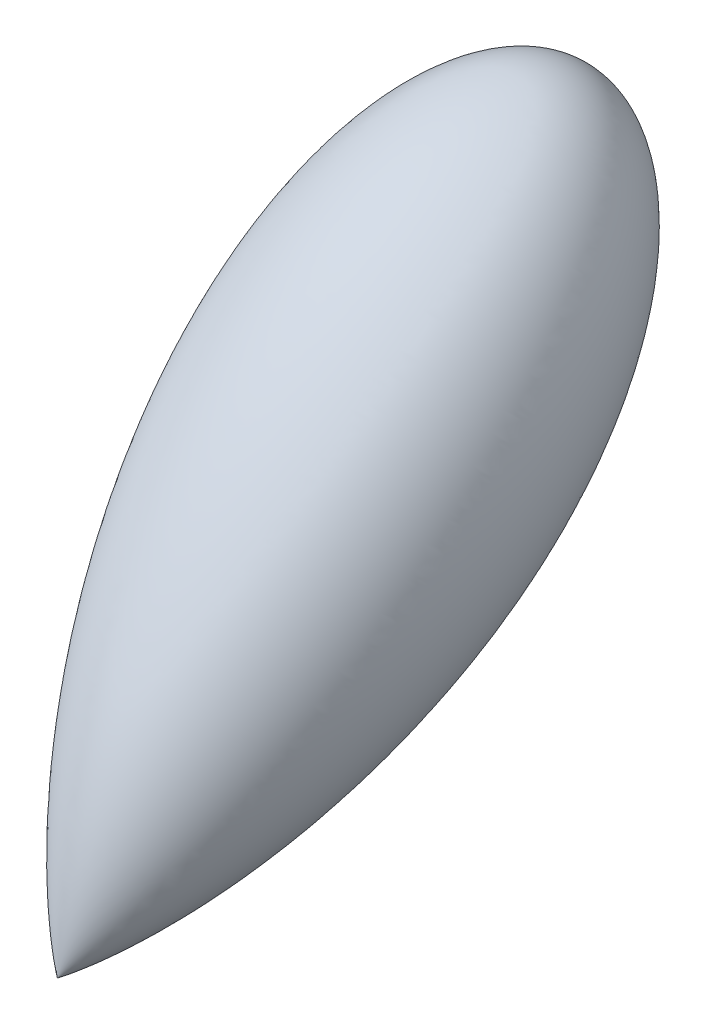
ISO-10303-21;
HEADER;
FILE_DESCRIPTION(('STEP AP214'),'2;1');
FILE_NAME('part.step','',(''),(''),'','','');
FILE_SCHEMA(('AUTOMOTIVE_DESIGN { 1 0 10303 214 1 1 1 1 }'));
ENDSEC;
DATA;
#1=APPLICATION_CONTEXT('core data for automotive mechanical design processes');
#2=APPLICATION_PROTOCOL_DEFINITION('international standard','automotive_design',2000,#1);
#3=PRODUCT_CONTEXT('',#1,'mechanical');
#4=PRODUCT('Part','Part','',(#3));
#5=PRODUCT_RELATED_PRODUCT_CATEGORY('part','',(#4));
#6=PRODUCT_DEFINITION_FORMATION('','',#4);
#7=PRODUCT_DEFINITION_CONTEXT('part definition',#1,'design');
#8=PRODUCT_DEFINITION('design','',#6,#7);
#9=PRODUCT_DEFINITION_SHAPE('','',#8);
#10=(LENGTH_UNIT() NAMED_UNIT(*) SI_UNIT(.MILLI.,.METRE.));
#11=(NAMED_UNIT(*) PLANE_ANGLE_UNIT() SI_UNIT($,.RADIAN.));
#12=(NAMED_UNIT(*) SI_UNIT($,.STERADIAN.) SOLID_ANGLE_UNIT());
#13=UNCERTAINTY_MEASURE_WITH_UNIT(LENGTH_MEASURE(1.E-05),#10,'distance_accuracy_value','');
#14=(GEOMETRIC_REPRESENTATION_CONTEXT(3) GLOBAL_UNCERTAINTY_ASSIGNED_CONTEXT((#13)) GLOBAL_UNIT_ASSIGNED_CONTEXT((#10,
#11,#12)) REPRESENTATION_CONTEXT('',''));
#15=CARTESIAN_POINT('',(0.,0.,0.));
#16=DIRECTION('',(0.,0.,1.));
#17=DIRECTION('',(1.,0.,0.));
#18=AXIS2_PLACEMENT_3D('',#15,#16,#17);
#19=CARTESIAN_POINT('',(0.,0.,0.));
#20=CARTESIAN_POINT('',(0.,0.00110567555076795,-0.094354720833639));
#21=CARTESIAN_POINT('',(0.,0.00504521301310699,-0.283019152573875));
#22=CARTESIAN_POINT('',(0.,0.0199895205036959,-0.660167993788696));
#23=CARTESIAN_POINT('',(0.,0.0532486602371946,-1.22535256144804));
#24=CARTESIAN_POINT('',(0.,0.103585971381559,-1.88394574076163));
#25=CARTESIAN_POINT('',(0.,0.191428270619039,-2.82343376189043));
#26=CARTESIAN_POINT('',(0.,0.318275664605795,-3.94863470695044));
#27=CARTESIAN_POINT('',(0.,0.533032850735263,-5.56209850780303));
#28=CARTESIAN_POINT('',(0.,0.8680085554524,-7.65863082214932));
#29=CARTESIAN_POINT('',(0.,1.44227535067574,-10.7191417637578));
#30=CARTESIAN_POINT('',(0.,2.3477362844714,-14.7232117889945));
#31=CARTESIAN_POINT('',(0.,3.5885537575819,-19.3493058343404));
#32=CARTESIAN_POINT('',(0.,5.63788288257515,-25.877167345863));
#33=CARTESIAN_POINT('',(0.,8.49778718930051,-33.5756882569507));
#34=CARTESIAN_POINT('',(0.,12.3581256339261,-42.3473439450072));
#35=CARTESIAN_POINT('',(0.,17.4287915483197,-52.0548865373281));
#36=CARTESIAN_POINT('',(0.,23.1248970838889,-61.4091196811586));
#37=CARTESIAN_POINT('',(0.,29.4303332985015,-70.3644857831347));
#38=CARTESIAN_POINT('',(0.,36.3419347640672,-78.8620662963186));
#39=CARTESIAN_POINT('',(0.,43.8679272504101,-86.8229661585936));
#40=CARTESIAN_POINT('',(0.,52.0275874425671,-94.1376024817946));
#41=CARTESIAN_POINT('',(0.,59.7196280749767,-99.8109531993216));
#42=CARTESIAN_POINT('',(0.,66.1405005248009,-103.655436536621));
#43=CARTESIAN_POINT('',(0.,70.9890757635774,-106.043957236976));
#44=CARTESIAN_POINT('',(0.,74.0675505492291,-107.36664037873));
#45=CARTESIAN_POINT('',(0.,76.5931415956172,-108.326529399047));
#46=CARTESIAN_POINT('',(0.,79.1780446207501,-109.171717734906));
#47=CARTESIAN_POINT('',(0.,81.8210552007608,-109.884563346157));
#48=CARTESIAN_POINT('',(0.,84.480094309856,-110.436792587242));
#49=CARTESIAN_POINT('',(0.,87.1481114600888,-110.811413655205));
#50=CARTESIAN_POINT('',(0.,89.6091669273944,-110.974941599135));
#51=CARTESIAN_POINT('',(0.,91.8472468143623,-110.958203645697));
#52=CARTESIAN_POINT('',(0.,93.8721901113655,-110.794285365465));
#53=CARTESIAN_POINT('',(0.,95.6771076157949,-110.520111371824));
#54=CARTESIAN_POINT('',(0.,97.360955148053,-110.129953801494));
#55=CARTESIAN_POINT('',(0.,98.7447668856492,-109.693048875941));
#56=CARTESIAN_POINT('',(0.,99.838334958507,-109.266506435088));
#57=CARTESIAN_POINT('',(0.,100.804591725503,-108.833271517733));
#58=CARTESIAN_POINT('',(0.,101.734315490863,-108.358875962494));
#59=CARTESIAN_POINT('',(0.,102.623692821032,-107.831508865081));
#60=CARTESIAN_POINT('',(0.,103.471642244776,-107.249165923286));
#61=CARTESIAN_POINT('',(0.,104.147555746676,-106.730261812035));
#62=CARTESIAN_POINT('',(0.,104.611268886759,-106.342142152966));
#63=CARTESIAN_POINT('',(0.,104.985577069252,-106.007845417404));
#64=CARTESIAN_POINT('',(0.,105.266740098409,-105.741228976342));
#65=CARTESIAN_POINT('',(0.,105.410279046826,-105.600974544891));
#66=CARTESIAN_POINT('',(0.,105.486492949201,-105.525143650119));
#67=CARTESIAN_POINT('',(0.,105.50581829927,-105.505818300051));
#68=B_SPLINE_CURVE_WITH_KNOTS('',4,(#19,#20,#21,#22,#23,#24,#25,#26,#27,#28,#29,#30,#31,#32,#33,
#34,#35,#36,#37,#38,#39,#40,#41,#42,#43,#44,#45,#46,#47,#48,#49,#50,#51,#52,#53,#54,#55,#56,#57,
#58,#59,#60,#61,#62,#63,#64,#65,#66,#67),.UNSPECIFIED.,.F.,.F.,(5,1,1,1,1,1,1,1,1,1,1,1,1,1,1,1,
1,1,1,1,1,1,1,1,1,1,1,1,1,1,1,1,1,1,1,1,1,1,1,1,1,1,1,1,1,5),(0.,0.00208022618325285,
0.00416045236650569,0.00832090473301139,0.0124813570995171,0.0166418094660228,
0.0249627141990342,0.0332836189320456,0.0483639995569485,0.0634443801818515,0.0936051414316575,
0.123765761606789,0.153926381781921,0.214247831989329,0.274569248607586,0.334890548913528,
0.395211973937977,0.455533331692356,0.515854717682652,0.576176117087502,0.636497510147846,
0.696818878628333,0.726204736308648,0.740897665148805,0.755590593988963,0.770670990357208,
0.785751386725454,0.800831654205914,0.815911921686374,0.830507415416075,0.845102909145775,
0.855156410391397,0.865209911637019,0.875263540404023,0.885317169171028,0.89322090695017,
0.897172775839741,0.901124644729312,0.908664775293416,0.91620490585752,0.919974979401008,
0.923745052944495,0.927515126487983,0.929400163259727,0.931285200031471,0.931931756753919),.UNSPECIFIED.);
#69=CARTESIAN_POINT('',(0.,105.505818299661,-105.505818299661));
#70=DIRECTION('',(0.,0.707106781186547,-0.707106781186548));
#71=AXIS1_PLACEMENT('',#69,#70);
#72=SURFACE_OF_REVOLUTION('',#68,#71);
#73=CARTESIAN_POINT('',(0.,105.505818299661,-105.505818299661));
#74=VERTEX_POINT('',#73);
#75=VERTEX_LOOP('',#74);
#76=FACE_BOUND('',#75,.T.);
#77=CARTESIAN_POINT('',(0.,0.,0.));
#78=VERTEX_POINT('',#77);
#79=VERTEX_LOOP('',#78);
#80=FACE_BOUND('',#79,.T.);
#81=ADVANCED_FACE('F39',(#76,#80),#72,.T.);
#82=CLOSED_SHELL('',(#81));
#83=MANIFOLD_SOLID_BREP('B2',#82);
#84=ADVANCED_BREP_SHAPE_REPRESENTATION('',(#18,#83),#14);
#85=SHAPE_DEFINITION_REPRESENTATION(#9,#84);
ENDSEC;
END-ISO-10303-21;
